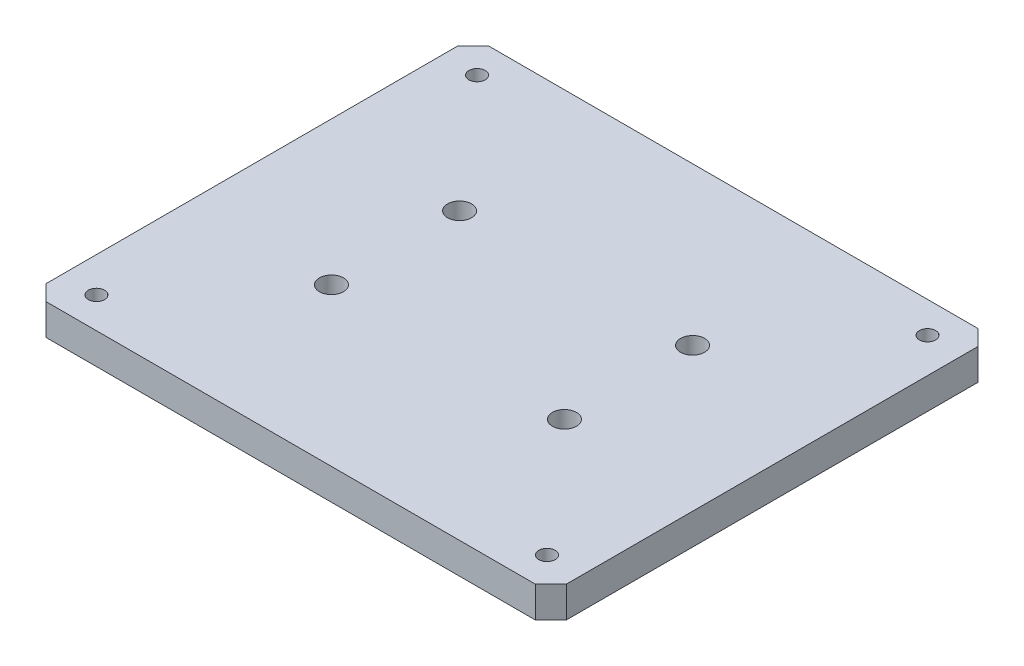
ISO-10303-21;
HEADER;
FILE_DESCRIPTION(('STEP AP214'),'2;1');
FILE_NAME('part.step','',(''),(''),'','','');
FILE_SCHEMA(('AUTOMOTIVE_DESIGN { 1 0 10303 214 1 1 1 1 }'));
ENDSEC;
DATA;
#1=APPLICATION_CONTEXT('core data for automotive mechanical design processes');
#2=APPLICATION_PROTOCOL_DEFINITION('international standard','automotive_design',2000,#1);
#3=PRODUCT_CONTEXT('',#1,'mechanical');
#4=PRODUCT('Part','Part','',(#3));
#5=PRODUCT_RELATED_PRODUCT_CATEGORY('part','',(#4));
#6=PRODUCT_DEFINITION_FORMATION('','',#4);
#7=PRODUCT_DEFINITION_CONTEXT('part definition',#1,'design');
#8=PRODUCT_DEFINITION('design','',#6,#7);
#9=PRODUCT_DEFINITION_SHAPE('','',#8);
#10=(LENGTH_UNIT() NAMED_UNIT(*) SI_UNIT(.MILLI.,.METRE.));
#11=(NAMED_UNIT(*) PLANE_ANGLE_UNIT() SI_UNIT($,.RADIAN.));
#12=(NAMED_UNIT(*) SI_UNIT($,.STERADIAN.) SOLID_ANGLE_UNIT());
#13=UNCERTAINTY_MEASURE_WITH_UNIT(LENGTH_MEASURE(1.E-05),#10,'distance_accuracy_value','');
#14=(GEOMETRIC_REPRESENTATION_CONTEXT(3) GLOBAL_UNCERTAINTY_ASSIGNED_CONTEXT((#13)) GLOBAL_UNIT_ASSIGNED_CONTEXT((#10,
#11,#12)) REPRESENTATION_CONTEXT('',''));
#15=CARTESIAN_POINT('',(0.,0.,0.));
#16=DIRECTION('',(0.,0.,1.));
#17=DIRECTION('',(1.,0.,0.));
#18=AXIS2_PLACEMENT_3D('',#15,#16,#17);
#19=CARTESIAN_POINT('',(0.,4.,0.));
#20=DIRECTION('',(0.,1.,0.));
#21=DIRECTION('',(0.,0.,1.));
#22=AXIS2_PLACEMENT_3D('',#19,#20,#21);
#23=PLANE('',#22);
#24=CARTESIAN_POINT('',(29.,4.,24.5));
#25=DIRECTION('',(0.,1.,0.));
#26=DIRECTION('',(0.,0.,-1.));
#27=AXIS2_PLACEMENT_3D('',#24,#25,#26);
#28=CIRCLE('',#27,1.05);
#29=CARTESIAN_POINT('',(29.,4.,23.45));
#30=VERTEX_POINT('',#29);
#31=EDGE_CURVE('E436',#30,#30,#28,.T.);
#32=ORIENTED_EDGE('',*,*,#31,.F.);
#33=EDGE_LOOP('',(#32));
#34=FACE_BOUND('',#33,.T.);
#35=CARTESIAN_POINT('',(-29.,4.,24.5));
#36=DIRECTION('',(0.,1.,0.));
#37=DIRECTION('',(0.,0.,1.));
#38=AXIS2_PLACEMENT_3D('',#35,#36,#37);
#39=CIRCLE('',#38,1.05);
#40=CARTESIAN_POINT('',(-29.,4.,25.55));
#41=VERTEX_POINT('',#40);
#42=EDGE_CURVE('E446',#41,#41,#39,.T.);
#43=ORIENTED_EDGE('',*,*,#42,.F.);
#44=EDGE_LOOP('',(#43));
#45=FACE_BOUND('',#44,.T.);
#46=CARTESIAN_POINT('',(-29.,4.,-24.5));
#47=DIRECTION('',(0.,1.,0.));
#48=DIRECTION('',(0.,0.,-1.));
#49=AXIS2_PLACEMENT_3D('',#46,#47,#48);
#50=CIRCLE('',#49,1.05);
#51=CARTESIAN_POINT('',(-29.,4.,-25.55));
#52=VERTEX_POINT('',#51);
#53=EDGE_CURVE('E429',#52,#52,#50,.T.);
#54=ORIENTED_EDGE('',*,*,#53,.F.);
#55=EDGE_LOOP('',(#54));
#56=FACE_BOUND('',#55,.T.);
#57=CARTESIAN_POINT('',(29.,4.,-24.5));
#58=DIRECTION('',(0.,1.,0.));
#59=DIRECTION('',(0.,0.,1.));
#60=AXIS2_PLACEMENT_3D('',#57,#58,#59);
#61=CIRCLE('',#60,1.05);
#62=CARTESIAN_POINT('',(29.,4.,-23.45));
#63=VERTEX_POINT('',#62);
#64=EDGE_CURVE('E422',#63,#63,#61,.T.);
#65=ORIENTED_EDGE('',*,*,#64,.F.);
#66=EDGE_LOOP('',(#65));
#67=FACE_BOUND('',#66,.T.);
#68=CARTESIAN_POINT('',(-15.,4.,8.25));
#69=DIRECTION('',(0.,1.,0.));
#70=DIRECTION('',(0.,0.,1.));
#71=AXIS2_PLACEMENT_3D('',#68,#69,#70);
#72=CIRCLE('',#71,1.55000000000001);
#73=CARTESIAN_POINT('',(-15.,4.,9.80000000000001));
#74=VERTEX_POINT('',#73);
#75=EDGE_CURVE('E404',#74,#74,#72,.T.);
#76=ORIENTED_EDGE('',*,*,#75,.F.);
#77=EDGE_LOOP('',(#76));
#78=FACE_BOUND('',#77,.T.);
#79=CARTESIAN_POINT('',(15.,4.,-8.25));
#80=DIRECTION('',(0.,1.,0.));
#81=DIRECTION('',(0.,0.,1.));
#82=AXIS2_PLACEMENT_3D('',#79,#80,#81);
#83=CIRCLE('',#82,1.55);
#84=CARTESIAN_POINT('',(15.,4.,-6.7));
#85=VERTEX_POINT('',#84);
#86=EDGE_CURVE('E181',#85,#85,#83,.T.);
#87=ORIENTED_EDGE('',*,*,#86,.F.);
#88=EDGE_LOOP('',(#87));
#89=FACE_BOUND('',#88,.T.);
#90=DIRECTION('',(0.,0.,1.));
#91=VECTOR('',#90,1.);
#92=CARTESIAN_POINT('',(-33.5,4.,-28.5));
#93=LINE('',#92,#91);
#94=CARTESIAN_POINT('',(-33.5,4.,-26.5));
#95=VERTEX_POINT('',#94);
#96=CARTESIAN_POINT('',(-33.5,4.,26.5));
#97=VERTEX_POINT('',#96);
#98=EDGE_CURVE('E191',#95,#97,#93,.T.);
#99=ORIENTED_EDGE('',*,*,#98,.T.);
#100=DIRECTION('',(-0.707106781186546,0.,-0.707106781186549));
#101=VECTOR('',#100,1.);
#102=CARTESIAN_POINT('',(-30.0000000000001,4.,30.));
#103=LINE('',#102,#101);
#104=CARTESIAN_POINT('',(-31.5,4.,28.5));
#105=VERTEX_POINT('',#104);
#106=EDGE_CURVE('E167',#97,#105,#103,.F.);
#107=ORIENTED_EDGE('',*,*,#106,.T.);
#108=DIRECTION('',(1.,0.,0.));
#109=VECTOR('',#108,1.);
#110=CARTESIAN_POINT('',(-33.5,4.,28.5));
#111=LINE('',#110,#109);
#112=CARTESIAN_POINT('',(31.5,4.,28.5));
#113=VERTEX_POINT('',#112);
#114=EDGE_CURVE('E134',#105,#113,#111,.T.);
#115=ORIENTED_EDGE('',*,*,#114,.T.);
#116=DIRECTION('',(-0.707106781186549,0.,0.707106781186546));
#117=VECTOR('',#116,1.);
#118=CARTESIAN_POINT('',(30.,4.,30.0000000000001));
#119=LINE('',#118,#117);
#120=CARTESIAN_POINT('',(33.5,4.,26.5));
#121=VERTEX_POINT('',#120);
#122=EDGE_CURVE('E162',#113,#121,#119,.F.);
#123=ORIENTED_EDGE('',*,*,#122,.T.);
#124=DIRECTION('',(0.,0.,-1.));
#125=VECTOR('',#124,1.);
#126=CARTESIAN_POINT('',(33.5,4.,-28.5));
#127=LINE('',#126,#125);
#128=CARTESIAN_POINT('',(33.5,4.,-26.5));
#129=VERTEX_POINT('',#128);
#130=EDGE_CURVE('E137',#121,#129,#127,.T.);
#131=ORIENTED_EDGE('',*,*,#130,.T.);
#132=DIRECTION('',(0.707106781186546,0.,0.707106781186549));
#133=VECTOR('',#132,1.);
#134=CARTESIAN_POINT('',(30.0000000000001,4.,-30.));
#135=LINE('',#134,#133);
#136=CARTESIAN_POINT('',(31.5,4.,-28.5));
#137=VERTEX_POINT('',#136);
#138=EDGE_CURVE('E66',#129,#137,#135,.F.);
#139=ORIENTED_EDGE('',*,*,#138,.T.);
#140=DIRECTION('',(-1.,0.,0.));
#141=VECTOR('',#140,1.);
#142=CARTESIAN_POINT('',(-33.5,4.,-28.5));
#143=LINE('',#142,#141);
#144=CARTESIAN_POINT('',(-31.5,4.,-28.5));
#145=VERTEX_POINT('',#144);
#146=EDGE_CURVE('E145',#137,#145,#143,.T.);
#147=ORIENTED_EDGE('',*,*,#146,.T.);
#148=DIRECTION('',(0.707106781186549,0.,-0.707106781186546));
#149=VECTOR('',#148,1.);
#150=CARTESIAN_POINT('',(-30.,4.,-30.0000000000001));
#151=LINE('',#150,#149);
#152=EDGE_CURVE('E158',#145,#95,#151,.F.);
#153=ORIENTED_EDGE('',*,*,#152,.T.);
#154=EDGE_LOOP('',(#99,#107,#115,#123,#131,#139,#147,#153));
#155=FACE_BOUND('',#154,.T.);
#156=CARTESIAN_POINT('',(-15.,4.,-8.25));
#157=DIRECTION('',(0.,1.,0.));
#158=DIRECTION('',(0.,0.,-1.));
#159=AXIS2_PLACEMENT_3D('',#156,#157,#158);
#160=CIRCLE('',#159,1.55000000000001);
#161=CARTESIAN_POINT('',(-15.,4.,-9.8));
#162=VERTEX_POINT('',#161);
#163=EDGE_CURVE('E398',#162,#162,#160,.T.);
#164=ORIENTED_EDGE('',*,*,#163,.F.);
#165=EDGE_LOOP('',(#164));
#166=FACE_BOUND('',#165,.T.);
#167=CARTESIAN_POINT('',(15.,4.,8.25));
#168=DIRECTION('',(0.,1.,0.));
#169=DIRECTION('',(0.,0.,-1.));
#170=AXIS2_PLACEMENT_3D('',#167,#168,#169);
#171=CIRCLE('',#170,1.54999999999999);
#172=CARTESIAN_POINT('',(15.,4.,6.70000000000001));
#173=VERTEX_POINT('',#172);
#174=EDGE_CURVE('E423',#173,#173,#171,.T.);
#175=ORIENTED_EDGE('',*,*,#174,.F.);
#176=EDGE_LOOP('',(#175));
#177=FACE_BOUND('',#176,.T.);
#178=ADVANCED_FACE('F46',(#34,#45,#56,#67,#78,#89,#155,#166,#177),#23,.T.);
#179=CARTESIAN_POINT('',(0.,0.,0.));
#180=DIRECTION('',(0.,1.,0.));
#181=DIRECTION('',(0.,0.,1.));
#182=AXIS2_PLACEMENT_3D('',#179,#180,#181);
#183=PLANE('',#182);
#184=CARTESIAN_POINT('',(29.,0.,24.5));
#185=DIRECTION('',(0.,1.,0.));
#186=DIRECTION('',(0.,0.,-1.));
#187=AXIS2_PLACEMENT_3D('',#184,#185,#186);
#188=CIRCLE('',#187,1.05);
#189=CARTESIAN_POINT('',(29.,0.,23.45));
#190=VERTEX_POINT('',#189);
#191=EDGE_CURVE('E433',#190,#190,#188,.T.);
#192=ORIENTED_EDGE('',*,*,#191,.T.);
#193=EDGE_LOOP('',(#192));
#194=FACE_BOUND('',#193,.T.);
#195=CARTESIAN_POINT('',(-29.,0.,24.5));
#196=DIRECTION('',(0.,1.,0.));
#197=DIRECTION('',(0.,0.,1.));
#198=AXIS2_PLACEMENT_3D('',#195,#196,#197);
#199=CIRCLE('',#198,1.05);
#200=CARTESIAN_POINT('',(-29.,0.,25.55));
#201=VERTEX_POINT('',#200);
#202=EDGE_CURVE('E442',#201,#201,#199,.T.);
#203=ORIENTED_EDGE('',*,*,#202,.T.);
#204=EDGE_LOOP('',(#203));
#205=FACE_BOUND('',#204,.T.);
#206=CARTESIAN_POINT('',(-29.,0.,-24.5));
#207=DIRECTION('',(0.,1.,0.));
#208=DIRECTION('',(0.,0.,-1.));
#209=AXIS2_PLACEMENT_3D('',#206,#207,#208);
#210=CIRCLE('',#209,1.05);
#211=CARTESIAN_POINT('',(-29.,0.,-25.55));
#212=VERTEX_POINT('',#211);
#213=EDGE_CURVE('E453',#212,#212,#210,.T.);
#214=ORIENTED_EDGE('',*,*,#213,.T.);
#215=EDGE_LOOP('',(#214));
#216=FACE_BOUND('',#215,.T.);
#217=CARTESIAN_POINT('',(29.,0.,-24.5));
#218=DIRECTION('',(0.,1.,0.));
#219=DIRECTION('',(0.,0.,1.));
#220=AXIS2_PLACEMENT_3D('',#217,#218,#219);
#221=CIRCLE('',#220,1.05);
#222=CARTESIAN_POINT('',(29.,0.,-23.45));
#223=VERTEX_POINT('',#222);
#224=EDGE_CURVE('E425',#223,#223,#221,.T.);
#225=ORIENTED_EDGE('',*,*,#224,.T.);
#226=EDGE_LOOP('',(#225));
#227=FACE_BOUND('',#226,.T.);
#228=DIRECTION('',(1.,0.,0.));
#229=VECTOR('',#228,1.);
#230=CARTESIAN_POINT('',(-33.5,0.,28.5));
#231=LINE('',#230,#229);
#232=CARTESIAN_POINT('',(-31.5,0.,28.5));
#233=VERTEX_POINT('',#232);
#234=CARTESIAN_POINT('',(31.5,0.,28.5));
#235=VERTEX_POINT('',#234);
#236=EDGE_CURVE('E128',#233,#235,#231,.T.);
#237=ORIENTED_EDGE('',*,*,#236,.F.);
#238=DIRECTION('',(0.707106781186546,0.,0.707106781186549));
#239=VECTOR('',#238,1.);
#240=CARTESIAN_POINT('',(-31.5,0.,28.5));
#241=LINE('',#240,#239);
#242=CARTESIAN_POINT('',(-33.5,0.,26.5));
#243=VERTEX_POINT('',#242);
#244=EDGE_CURVE('E114',#233,#243,#241,.F.);
#245=ORIENTED_EDGE('',*,*,#244,.T.);
#246=DIRECTION('',(0.,0.,1.));
#247=VECTOR('',#246,1.);
#248=CARTESIAN_POINT('',(-33.5,0.,-28.5));
#249=LINE('',#248,#247);
#250=CARTESIAN_POINT('',(-33.5,0.,-26.5));
#251=VERTEX_POINT('',#250);
#252=EDGE_CURVE('E143',#251,#243,#249,.T.);
#253=ORIENTED_EDGE('',*,*,#252,.F.);
#254=DIRECTION('',(-0.707106781186549,0.,0.707106781186546));
#255=VECTOR('',#254,1.);
#256=CARTESIAN_POINT('',(-33.5,0.,-26.5));
#257=LINE('',#256,#255);
#258=CARTESIAN_POINT('',(-31.5,0.,-28.5));
#259=VERTEX_POINT('',#258);
#260=EDGE_CURVE('E133',#251,#259,#257,.F.);
#261=ORIENTED_EDGE('',*,*,#260,.T.);
#262=DIRECTION('',(-1.,0.,0.));
#263=VECTOR('',#262,1.);
#264=CARTESIAN_POINT('',(-33.5,0.,-28.5));
#265=LINE('',#264,#263);
#266=CARTESIAN_POINT('',(31.5,0.,-28.5));
#267=VERTEX_POINT('',#266);
#268=EDGE_CURVE('E148',#267,#259,#265,.T.);
#269=ORIENTED_EDGE('',*,*,#268,.F.);
#270=DIRECTION('',(-0.707106781186546,0.,-0.707106781186549));
#271=VECTOR('',#270,1.);
#272=CARTESIAN_POINT('',(31.5,0.,-28.5));
#273=LINE('',#272,#271);
#274=CARTESIAN_POINT('',(33.5,0.,-26.5));
#275=VERTEX_POINT('',#274);
#276=EDGE_CURVE('E155',#267,#275,#273,.F.);
#277=ORIENTED_EDGE('',*,*,#276,.T.);
#278=DIRECTION('',(0.,0.,-1.));
#279=VECTOR('',#278,1.);
#280=CARTESIAN_POINT('',(33.5,0.,-28.5));
#281=LINE('',#280,#279);
#282=CARTESIAN_POINT('',(33.5,0.,26.5));
#283=VERTEX_POINT('',#282);
#284=EDGE_CURVE('E176',#283,#275,#281,.T.);
#285=ORIENTED_EDGE('',*,*,#284,.F.);
#286=DIRECTION('',(0.707106781186549,0.,-0.707106781186546));
#287=VECTOR('',#286,1.);
#288=CARTESIAN_POINT('',(33.5,0.,26.5));
#289=LINE('',#288,#287);
#290=EDGE_CURVE('E124',#283,#235,#289,.F.);
#291=ORIENTED_EDGE('',*,*,#290,.T.);
#292=EDGE_LOOP('',(#237,#245,#253,#261,#269,#277,#285,#291));
#293=FACE_BOUND('',#292,.T.);
#294=CARTESIAN_POINT('',(15.,0.,-8.25));
#295=DIRECTION('',(0.,1.,0.));
#296=DIRECTION('',(0.,0.,1.));
#297=AXIS2_PLACEMENT_3D('',#294,#295,#296);
#298=CIRCLE('',#297,1.55);
#299=CARTESIAN_POINT('',(15.,0.,-6.7));
#300=VERTEX_POINT('',#299);
#301=EDGE_CURVE('E187',#300,#300,#298,.T.);
#302=ORIENTED_EDGE('',*,*,#301,.T.);
#303=EDGE_LOOP('',(#302));
#304=FACE_BOUND('',#303,.T.);
#305=CARTESIAN_POINT('',(-15.,0.,-8.25));
#306=DIRECTION('',(0.,1.,0.));
#307=DIRECTION('',(0.,0.,-1.));
#308=AXIS2_PLACEMENT_3D('',#305,#306,#307);
#309=CIRCLE('',#308,1.55000000000001);
#310=CARTESIAN_POINT('',(-15.,0.,-9.8));
#311=VERTEX_POINT('',#310);
#312=EDGE_CURVE('E399',#311,#311,#309,.T.);
#313=ORIENTED_EDGE('',*,*,#312,.T.);
#314=EDGE_LOOP('',(#313));
#315=FACE_BOUND('',#314,.T.);
#316=CARTESIAN_POINT('',(-15.,0.,8.25));
#317=DIRECTION('',(0.,1.,0.));
#318=DIRECTION('',(0.,0.,1.));
#319=AXIS2_PLACEMENT_3D('',#316,#317,#318);
#320=CIRCLE('',#319,1.55000000000001);
#321=CARTESIAN_POINT('',(-15.,0.,9.80000000000001));
#322=VERTEX_POINT('',#321);
#323=EDGE_CURVE('E409',#322,#322,#320,.T.);
#324=ORIENTED_EDGE('',*,*,#323,.T.);
#325=EDGE_LOOP('',(#324));
#326=FACE_BOUND('',#325,.T.);
#327=CARTESIAN_POINT('',(15.,0.,8.25));
#328=DIRECTION('',(0.,1.,0.));
#329=DIRECTION('',(0.,0.,-1.));
#330=AXIS2_PLACEMENT_3D('',#327,#328,#329);
#331=CIRCLE('',#330,1.54999999999999);
#332=CARTESIAN_POINT('',(15.,0.,6.70000000000001));
#333=VERTEX_POINT('',#332);
#334=EDGE_CURVE('E420',#333,#333,#331,.T.);
#335=ORIENTED_EDGE('',*,*,#334,.T.);
#336=EDGE_LOOP('',(#335));
#337=FACE_BOUND('',#336,.T.);
#338=ADVANCED_FACE('F140',(#194,#205,#216,#227,#293,#304,#315,#326,#337),#183,.F.);
#339=CARTESIAN_POINT('',(33.5,4.,-28.5));
#340=DIRECTION('',(-1.,0.,0.));
#341=DIRECTION('',(0.,0.,1.));
#342=AXIS2_PLACEMENT_3D('',#339,#340,#341);
#343=PLANE('',#342);
#344=ORIENTED_EDGE('',*,*,#130,.F.);
#345=DIRECTION('',(0.,-1.,0.));
#346=VECTOR('',#345,1.);
#347=CARTESIAN_POINT('',(33.5,4.,26.5));
#348=LINE('',#347,#346);
#349=EDGE_CURVE('E171',#121,#283,#348,.T.);
#350=ORIENTED_EDGE('',*,*,#349,.T.);
#351=ORIENTED_EDGE('',*,*,#284,.T.);
#352=DIRECTION('',(0.,1.,0.));
#353=VECTOR('',#352,1.);
#354=CARTESIAN_POINT('',(33.5,4.,-26.5));
#355=LINE('',#354,#353);
#356=EDGE_CURVE('E166',#275,#129,#355,.T.);
#357=ORIENTED_EDGE('',*,*,#356,.T.);
#358=EDGE_LOOP('',(#344,#350,#351,#357));
#359=FACE_BOUND('',#358,.T.);
#360=ADVANCED_FACE('F180',(#359),#343,.F.);
#361=CARTESIAN_POINT('',(-33.5,4.,-28.5));
#362=DIRECTION('',(0.,0.,1.));
#363=DIRECTION('',(1.,0.,0.));
#364=AXIS2_PLACEMENT_3D('',#361,#362,#363);
#365=PLANE('',#364);
#366=ORIENTED_EDGE('',*,*,#146,.F.);
#367=DIRECTION('',(0.,-1.,0.));
#368=VECTOR('',#367,1.);
#369=CARTESIAN_POINT('',(31.5,4.,-28.5));
#370=LINE('',#369,#368);
#371=EDGE_CURVE('E12',#137,#267,#370,.T.);
#372=ORIENTED_EDGE('',*,*,#371,.T.);
#373=ORIENTED_EDGE('',*,*,#268,.T.);
#374=DIRECTION('',(0.,1.,0.));
#375=VECTOR('',#374,1.);
#376=CARTESIAN_POINT('',(-31.5,4.,-28.5));
#377=LINE('',#376,#375);
#378=EDGE_CURVE('E54',#259,#145,#377,.T.);
#379=ORIENTED_EDGE('',*,*,#378,.T.);
#380=EDGE_LOOP('',(#366,#372,#373,#379));
#381=FACE_BOUND('',#380,.T.);
#382=ADVANCED_FACE('F212',(#381),#365,.F.);
#383=CARTESIAN_POINT('',(-33.5,4.,-28.5));
#384=DIRECTION('',(1.,0.,0.));
#385=DIRECTION('',(0.,0.,-1.));
#386=AXIS2_PLACEMENT_3D('',#383,#384,#385);
#387=PLANE('',#386);
#388=ORIENTED_EDGE('',*,*,#252,.T.);
#389=DIRECTION('',(0.,1.,0.));
#390=VECTOR('',#389,1.);
#391=CARTESIAN_POINT('',(-33.5,4.,26.5));
#392=LINE('',#391,#390);
#393=EDGE_CURVE('E119',#243,#97,#392,.T.);
#394=ORIENTED_EDGE('',*,*,#393,.T.);
#395=ORIENTED_EDGE('',*,*,#98,.F.);
#396=DIRECTION('',(0.,-1.,0.));
#397=VECTOR('',#396,1.);
#398=CARTESIAN_POINT('',(-33.5,4.,-26.5));
#399=LINE('',#398,#397);
#400=EDGE_CURVE('E121',#95,#251,#399,.T.);
#401=ORIENTED_EDGE('',*,*,#400,.T.);
#402=EDGE_LOOP('',(#388,#394,#395,#401));
#403=FACE_BOUND('',#402,.T.);
#404=ADVANCED_FACE('F215',(#403),#387,.F.);
#405=CARTESIAN_POINT('',(-33.5,4.,28.5));
#406=DIRECTION('',(0.,0.,-1.));
#407=DIRECTION('',(-1.,0.,0.));
#408=AXIS2_PLACEMENT_3D('',#405,#406,#407);
#409=PLANE('',#408);
#410=ORIENTED_EDGE('',*,*,#114,.F.);
#411=DIRECTION('',(0.,-1.,0.));
#412=VECTOR('',#411,1.);
#413=CARTESIAN_POINT('',(-31.5,4.,28.5));
#414=LINE('',#413,#412);
#415=EDGE_CURVE('E117',#105,#233,#414,.T.);
#416=ORIENTED_EDGE('',*,*,#415,.T.);
#417=ORIENTED_EDGE('',*,*,#236,.T.);
#418=DIRECTION('',(0.,1.,0.));
#419=VECTOR('',#418,1.);
#420=CARTESIAN_POINT('',(31.5,4.,28.5));
#421=LINE('',#420,#419);
#422=EDGE_CURVE('E135',#235,#113,#421,.T.);
#423=ORIENTED_EDGE('',*,*,#422,.T.);
#424=EDGE_LOOP('',(#410,#416,#417,#423));
#425=FACE_BOUND('',#424,.T.);
#426=ADVANCED_FACE('F129',(#425),#409,.F.);
#427=CARTESIAN_POINT('',(15.,4.,-8.25));
#428=DIRECTION('',(0.,-1.,0.));
#429=DIRECTION('',(0.,0.,-1.));
#430=AXIS2_PLACEMENT_3D('',#427,#428,#429);
#431=CYLINDRICAL_SURFACE('',#430,1.55);
#432=ORIENTED_EDGE('',*,*,#86,.T.);
#433=EDGE_LOOP('',(#432));
#434=FACE_BOUND('',#433,.T.);
#435=ORIENTED_EDGE('',*,*,#301,.F.);
#436=EDGE_LOOP('',(#435));
#437=FACE_BOUND('',#436,.T.);
#438=ADVANCED_FACE('F238',(#434,#437),#431,.F.);
#439=CARTESIAN_POINT('',(-15.,4.,-8.25));
#440=DIRECTION('',(0.,-1.,0.));
#441=DIRECTION('',(0.,0.,-1.));
#442=AXIS2_PLACEMENT_3D('',#439,#440,#441);
#443=CYLINDRICAL_SURFACE('',#442,1.55000000000001);
#444=ORIENTED_EDGE('',*,*,#163,.T.);
#445=EDGE_LOOP('',(#444));
#446=FACE_BOUND('',#445,.T.);
#447=ORIENTED_EDGE('',*,*,#312,.F.);
#448=EDGE_LOOP('',(#447));
#449=FACE_BOUND('',#448,.T.);
#450=ADVANCED_FACE('F363',(#446,#449),#443,.F.);
#451=CARTESIAN_POINT('',(-15.,4.,8.25));
#452=DIRECTION('',(0.,-1.,0.));
#453=DIRECTION('',(0.,0.,-1.));
#454=AXIS2_PLACEMENT_3D('',#451,#452,#453);
#455=CYLINDRICAL_SURFACE('',#454,1.55000000000001);
#456=ORIENTED_EDGE('',*,*,#75,.T.);
#457=EDGE_LOOP('',(#456));
#458=FACE_BOUND('',#457,.T.);
#459=ORIENTED_EDGE('',*,*,#323,.F.);
#460=EDGE_LOOP('',(#459));
#461=FACE_BOUND('',#460,.T.);
#462=ADVANCED_FACE('F351',(#458,#461),#455,.F.);
#463=CARTESIAN_POINT('',(15.,4.,8.25));
#464=DIRECTION('',(0.,-1.,0.));
#465=DIRECTION('',(0.,0.,-1.));
#466=AXIS2_PLACEMENT_3D('',#463,#464,#465);
#467=CYLINDRICAL_SURFACE('',#466,1.54999999999999);
#468=ORIENTED_EDGE('',*,*,#174,.T.);
#469=EDGE_LOOP('',(#468));
#470=FACE_BOUND('',#469,.T.);
#471=ORIENTED_EDGE('',*,*,#334,.F.);
#472=EDGE_LOOP('',(#471));
#473=FACE_BOUND('',#472,.T.);
#474=ADVANCED_FACE('F343',(#470,#473),#467,.F.);
#475=CARTESIAN_POINT('',(29.,0.,-24.5));
#476=DIRECTION('',(0.,1.,0.));
#477=DIRECTION('',(0.,0.,1.));
#478=AXIS2_PLACEMENT_3D('',#475,#476,#477);
#479=CYLINDRICAL_SURFACE('',#478,1.05);
#480=ORIENTED_EDGE('',*,*,#224,.F.);
#481=EDGE_LOOP('',(#480));
#482=FACE_BOUND('',#481,.T.);
#483=ORIENTED_EDGE('',*,*,#64,.T.);
#484=EDGE_LOOP('',(#483));
#485=FACE_BOUND('',#484,.T.);
#486=ADVANCED_FACE('F332',(#482,#485),#479,.F.);
#487=CARTESIAN_POINT('',(-29.,0.,-24.5));
#488=DIRECTION('',(0.,1.,0.));
#489=DIRECTION('',(0.,0.,1.));
#490=AXIS2_PLACEMENT_3D('',#487,#488,#489);
#491=CYLINDRICAL_SURFACE('',#490,1.05);
#492=ORIENTED_EDGE('',*,*,#213,.F.);
#493=EDGE_LOOP('',(#492));
#494=FACE_BOUND('',#493,.T.);
#495=ORIENTED_EDGE('',*,*,#53,.T.);
#496=EDGE_LOOP('',(#495));
#497=FACE_BOUND('',#496,.T.);
#498=ADVANCED_FACE('F321',(#494,#497),#491,.F.);
#499=CARTESIAN_POINT('',(-29.,0.,24.5));
#500=DIRECTION('',(0.,1.,0.));
#501=DIRECTION('',(0.,0.,1.));
#502=AXIS2_PLACEMENT_3D('',#499,#500,#501);
#503=CYLINDRICAL_SURFACE('',#502,1.05);
#504=ORIENTED_EDGE('',*,*,#202,.F.);
#505=EDGE_LOOP('',(#504));
#506=FACE_BOUND('',#505,.T.);
#507=ORIENTED_EDGE('',*,*,#42,.T.);
#508=EDGE_LOOP('',(#507));
#509=FACE_BOUND('',#508,.T.);
#510=ADVANCED_FACE('F313',(#506,#509),#503,.F.);
#511=CARTESIAN_POINT('',(29.,0.,24.5));
#512=DIRECTION('',(0.,1.,0.));
#513=DIRECTION('',(0.,0.,1.));
#514=AXIS2_PLACEMENT_3D('',#511,#512,#513);
#515=CYLINDRICAL_SURFACE('',#514,1.05);
#516=ORIENTED_EDGE('',*,*,#191,.F.);
#517=EDGE_LOOP('',(#516));
#518=FACE_BOUND('',#517,.T.);
#519=ORIENTED_EDGE('',*,*,#31,.T.);
#520=EDGE_LOOP('',(#519));
#521=FACE_BOUND('',#520,.T.);
#522=ADVANCED_FACE('F223',(#518,#521),#515,.F.);
#523=CARTESIAN_POINT('',(-31.5,4.,28.5));
#524=DIRECTION('',(0.707106781186549,0.,-0.707106781186546));
#525=DIRECTION('',(0.,-1.,0.));
#526=AXIS2_PLACEMENT_3D('',#523,#524,#525);
#527=PLANE('',#526);
#528=ORIENTED_EDGE('',*,*,#106,.F.);
#529=ORIENTED_EDGE('',*,*,#393,.F.);
#530=ORIENTED_EDGE('',*,*,#244,.F.);
#531=ORIENTED_EDGE('',*,*,#415,.F.);
#532=EDGE_LOOP('',(#528,#529,#530,#531));
#533=FACE_BOUND('',#532,.T.);
#534=ADVANCED_FACE('F116',(#533),#527,.F.);
#535=CARTESIAN_POINT('',(33.5,4.,26.5));
#536=DIRECTION('',(-0.707106781186546,0.,-0.707106781186549));
#537=DIRECTION('',(0.,-1.,0.));
#538=AXIS2_PLACEMENT_3D('',#535,#536,#537);
#539=PLANE('',#538);
#540=ORIENTED_EDGE('',*,*,#122,.F.);
#541=ORIENTED_EDGE('',*,*,#422,.F.);
#542=ORIENTED_EDGE('',*,*,#290,.F.);
#543=ORIENTED_EDGE('',*,*,#349,.F.);
#544=EDGE_LOOP('',(#540,#541,#542,#543));
#545=FACE_BOUND('',#544,.T.);
#546=ADVANCED_FACE('F217',(#545),#539,.F.);
#547=CARTESIAN_POINT('',(31.5,4.,-28.5));
#548=DIRECTION('',(-0.707106781186549,0.,0.707106781186546));
#549=DIRECTION('',(0.,-1.,0.));
#550=AXIS2_PLACEMENT_3D('',#547,#548,#549);
#551=PLANE('',#550);
#552=ORIENTED_EDGE('',*,*,#138,.F.);
#553=ORIENTED_EDGE('',*,*,#356,.F.);
#554=ORIENTED_EDGE('',*,*,#276,.F.);
#555=ORIENTED_EDGE('',*,*,#371,.F.);
#556=EDGE_LOOP('',(#552,#553,#554,#555));
#557=FACE_BOUND('',#556,.T.);
#558=ADVANCED_FACE('F220',(#557),#551,.F.);
#559=CARTESIAN_POINT('',(-33.5,4.,-26.5));
#560=DIRECTION('',(0.707106781186546,0.,0.707106781186549));
#561=DIRECTION('',(0.,-1.,0.));
#562=AXIS2_PLACEMENT_3D('',#559,#560,#561);
#563=PLANE('',#562);
#564=ORIENTED_EDGE('',*,*,#152,.F.);
#565=ORIENTED_EDGE('',*,*,#378,.F.);
#566=ORIENTED_EDGE('',*,*,#260,.F.);
#567=ORIENTED_EDGE('',*,*,#400,.F.);
#568=EDGE_LOOP('',(#564,#565,#566,#567));
#569=FACE_BOUND('',#568,.T.);
#570=ADVANCED_FACE('F47',(#569),#563,.F.);
#571=CLOSED_SHELL('',(#178,#338,#360,#382,#404,#426,#438,#450,#462,#474,#486,#498,#510,#522,
#534,#546,#558,#570));
#572=MANIFOLD_SOLID_BREP('B2',#571);
#573=ADVANCED_BREP_SHAPE_REPRESENTATION('',(#18,#572),#14);
#574=SHAPE_DEFINITION_REPRESENTATION(#9,#573);
ENDSEC;
END-ISO-10303-21;
